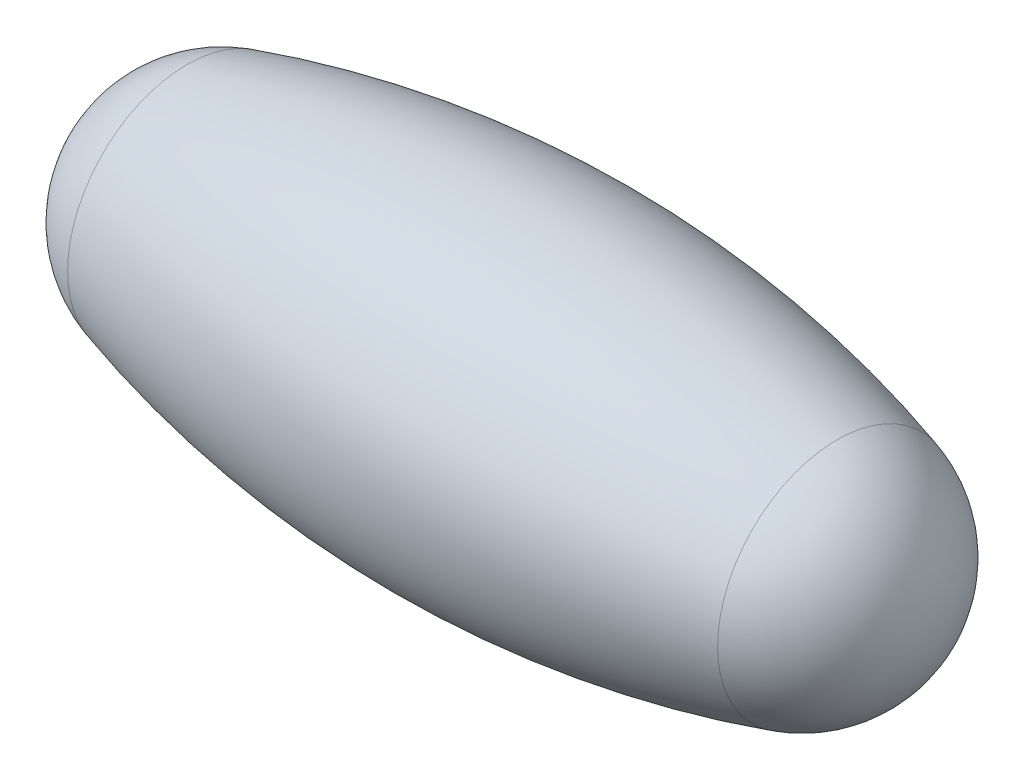
ISO-10303-21;
HEADER;
FILE_DESCRIPTION(('STEP AP214'),'2;1');
FILE_NAME('part.step','',(''),(''),'','','');
FILE_SCHEMA(('AUTOMOTIVE_DESIGN { 1 0 10303 214 1 1 1 1 }'));
ENDSEC;
DATA;
#1=APPLICATION_CONTEXT('core data for automotive mechanical design processes');
#2=APPLICATION_PROTOCOL_DEFINITION('international standard','automotive_design',2000,#1);
#3=PRODUCT_CONTEXT('',#1,'mechanical');
#4=PRODUCT('Part','Part','',(#3));
#5=PRODUCT_RELATED_PRODUCT_CATEGORY('part','',(#4));
#6=PRODUCT_DEFINITION_FORMATION('','',#4);
#7=PRODUCT_DEFINITION_CONTEXT('part definition',#1,'design');
#8=PRODUCT_DEFINITION('design','',#6,#7);
#9=PRODUCT_DEFINITION_SHAPE('','',#8);
#10=(LENGTH_UNIT() NAMED_UNIT(*) SI_UNIT(.MILLI.,.METRE.));
#11=(NAMED_UNIT(*) PLANE_ANGLE_UNIT() SI_UNIT($,.RADIAN.));
#12=(NAMED_UNIT(*) SI_UNIT($,.STERADIAN.) SOLID_ANGLE_UNIT());
#13=UNCERTAINTY_MEASURE_WITH_UNIT(LENGTH_MEASURE(1.E-05),#10,'distance_accuracy_value','');
#14=(GEOMETRIC_REPRESENTATION_CONTEXT(3) GLOBAL_UNCERTAINTY_ASSIGNED_CONTEXT((#13)) GLOBAL_UNIT_ASSIGNED_CONTEXT((#10,
#11,#12)) REPRESENTATION_CONTEXT('',''));
#15=CARTESIAN_POINT('',(0.,0.,0.));
#16=DIRECTION('',(0.,0.,1.));
#17=DIRECTION('',(1.,0.,0.));
#18=AXIS2_PLACEMENT_3D('',#15,#16,#17);
#19=CARTESIAN_POINT('',(-44.45,0.,0.));
#20=DIRECTION('',(-1.,0.,0.));
#21=DIRECTION('',(0.,1.,0.));
#22=AXIS2_PLACEMENT_3D('',#19,#20,#21);
#23=SPHERICAL_SURFACE('',#22,19.05);
#24=CARTESIAN_POINT('',(-49.784,0.,0.));
#25=DIRECTION('',(-1.,0.,0.));
#26=DIRECTION('',(0.,0.,1.));
#27=AXIS2_PLACEMENT_3D('',#24,#25,#26);
#28=CIRCLE('',#27,18.288);
#29=CARTESIAN_POINT('',(-49.784,0.,18.288));
#30=VERTEX_POINT('',#29);
#31=EDGE_CURVE('E10',#30,#30,#28,.T.);
#32=ORIENTED_EDGE('',*,*,#31,.T.);
#33=EDGE_LOOP('',(#32));
#34=FACE_BOUND('',#33,.T.);
#35=ADVANCED_FACE('F37',(#34),#23,.T.);
#36=CARTESIAN_POINT('',(0.,0.,0.));
#37=DIRECTION('',(-1.,0.,0.));
#38=DIRECTION('',(0.,0.,1.));
#39=AXIS2_PLACEMENT_3D('',#36,#37,#38);
#40=DEGENERATE_TOROIDAL_SURFACE('',#39,152.4,177.8,.F.);
#41=ORIENTED_EDGE('',*,*,#31,.F.);
#42=EDGE_LOOP('',(#41));
#43=FACE_BOUND('',#42,.T.);
#44=CARTESIAN_POINT('',(49.784,0.,0.));
#45=DIRECTION('',(-1.,0.,0.));
#46=DIRECTION('',(0.,0.,1.));
#47=AXIS2_PLACEMENT_3D('',#44,#45,#46);
#48=CIRCLE('',#47,18.288);
#49=CARTESIAN_POINT('',(49.784,0.,18.288));
#50=VERTEX_POINT('',#49);
#51=EDGE_CURVE('E43',#50,#50,#48,.T.);
#52=ORIENTED_EDGE('',*,*,#51,.T.);
#53=EDGE_LOOP('',(#52));
#54=FACE_BOUND('',#53,.T.);
#55=ADVANCED_FACE('F49',(#43,#54),#40,.F.);
#56=CARTESIAN_POINT('',(44.45,0.,0.));
#57=DIRECTION('',(-1.,0.,0.));
#58=DIRECTION('',(0.,-1.,0.));
#59=AXIS2_PLACEMENT_3D('',#56,#57,#58);
#60=SPHERICAL_SURFACE('',#59,19.05);
#61=ORIENTED_EDGE('',*,*,#51,.F.);
#62=EDGE_LOOP('',(#61));
#63=FACE_BOUND('',#62,.T.);
#64=ADVANCED_FACE('F51',(#63),#60,.T.);
#65=CLOSED_SHELL('',(#35,#55,#64));
#66=MANIFOLD_SOLID_BREP('B2',#65);
#67=ADVANCED_BREP_SHAPE_REPRESENTATION('',(#18,#66),#14);
#68=SHAPE_DEFINITION_REPRESENTATION(#9,#67);
ENDSEC;
END-ISO-10303-21;
